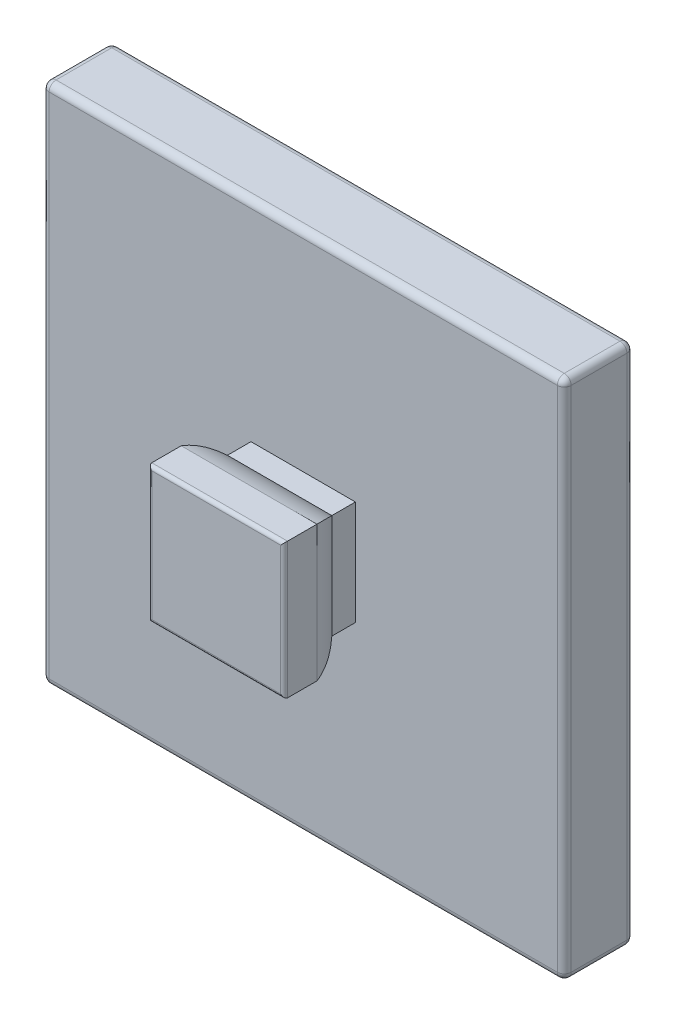
ISO-10303-21;
HEADER;
FILE_DESCRIPTION(('STEP AP214'),'2;1');
FILE_NAME('part.step','',(''),(''),'','','');
FILE_SCHEMA(('AUTOMOTIVE_DESIGN { 1 0 10303 214 1 1 1 1 }'));
ENDSEC;
DATA;
#1=APPLICATION_CONTEXT('core data for automotive mechanical design processes');
#2=APPLICATION_PROTOCOL_DEFINITION('international standard','automotive_design',2000,#1);
#3=PRODUCT_CONTEXT('',#1,'mechanical');
#4=PRODUCT('Part','Part','',(#3));
#5=PRODUCT_RELATED_PRODUCT_CATEGORY('part','',(#4));
#6=PRODUCT_DEFINITION_FORMATION('','',#4);
#7=PRODUCT_DEFINITION_CONTEXT('part definition',#1,'design');
#8=PRODUCT_DEFINITION('design','',#6,#7);
#9=PRODUCT_DEFINITION_SHAPE('','',#8);
#10=(LENGTH_UNIT() NAMED_UNIT(*) SI_UNIT(.MILLI.,.METRE.));
#11=(NAMED_UNIT(*) PLANE_ANGLE_UNIT() SI_UNIT($,.RADIAN.));
#12=(NAMED_UNIT(*) SI_UNIT($,.STERADIAN.) SOLID_ANGLE_UNIT());
#13=UNCERTAINTY_MEASURE_WITH_UNIT(LENGTH_MEASURE(1.E-05),#10,'distance_accuracy_value','');
#14=(GEOMETRIC_REPRESENTATION_CONTEXT(3) GLOBAL_UNCERTAINTY_ASSIGNED_CONTEXT((#13)) GLOBAL_UNIT_ASSIGNED_CONTEXT((#10,
#11,#12)) REPRESENTATION_CONTEXT('',''));
#15=CARTESIAN_POINT('',(0.,0.,0.));
#16=DIRECTION('',(0.,0.,1.));
#17=DIRECTION('',(1.,0.,0.));
#18=AXIS2_PLACEMENT_3D('',#15,#16,#17);
#19=CARTESIAN_POINT('',(0.,-2.,2.));
#20=DIRECTION('',(0.,1.,0.));
#21=DIRECTION('',(0.,0.,1.));
#22=AXIS2_PLACEMENT_3D('',#19,#20,#21);
#23=CYLINDRICAL_SURFACE('',#22,2.);
#24=DIRECTION('',(0.,1.,0.));
#25=VECTOR('',#24,1.);
#26=CARTESIAN_POINT('',(-1.95,-2.,1.55559027913422));
#27=LINE('',#26,#25);
#28=CARTESIAN_POINT('',(-1.95,-1.95,1.55559027913422));
#29=VERTEX_POINT('',#28);
#30=CARTESIAN_POINT('',(-1.95,1.95,1.55559027913422));
#31=VERTEX_POINT('',#30);
#32=EDGE_CURVE('E204',#29,#31,#27,.T.);
#33=ORIENTED_EDGE('',*,*,#32,.T.);
#34=CARTESIAN_POINT('',(0.,0.,2.));
#35=DIRECTION('',(0.707106781186547,0.707106781186548,0.));
#36=DIRECTION('',(0.707106781186547,-0.707106781186548,0.));
#37=AXIS2_PLACEMENT_3D('',#34,#35,#36);
#38=ELLIPSE('',#37,2.82842712474619,2.);
#39=CARTESIAN_POINT('',(-1.5,1.5,0.677124344467706));
#40=VERTEX_POINT('',#39);
#41=EDGE_CURVE('E186',#31,#40,#38,.F.);
#42=ORIENTED_EDGE('',*,*,#41,.T.);
#43=DIRECTION('',(0.,1.,0.));
#44=VECTOR('',#43,1.);
#45=CARTESIAN_POINT('',(-1.5,-2.,0.677124344467706));
#46=LINE('',#45,#44);
#47=CARTESIAN_POINT('',(-1.5,-1.5,0.677124344467706));
#48=VERTEX_POINT('',#47);
#49=EDGE_CURVE('E201',#48,#40,#46,.T.);
#50=ORIENTED_EDGE('',*,*,#49,.F.);
#51=CARTESIAN_POINT('',(0.,0.,2.));
#52=DIRECTION('',(0.707106781186547,-0.707106781186548,0.));
#53=DIRECTION('',(0.707106781186547,0.707106781186548,0.));
#54=AXIS2_PLACEMENT_3D('',#51,#52,#53);
#55=ELLIPSE('',#54,2.82842712474619,2.);
#56=EDGE_CURVE('E498',#48,#29,#55,.F.);
#57=ORIENTED_EDGE('',*,*,#56,.T.);
#58=EDGE_LOOP('',(#33,#42,#50,#57));
#59=FACE_BOUND('',#58,.T.);
#60=ADVANCED_FACE('F34',(#59),#23,.T.);
#61=CARTESIAN_POINT('',(0.,-2.,2.));
#62=DIRECTION('',(0.,1.,0.));
#63=DIRECTION('',(0.,0.,1.));
#64=AXIS2_PLACEMENT_3D('',#61,#62,#63);
#65=CYLINDRICAL_SURFACE('',#64,2.);
#66=DIRECTION('',(0.,1.,0.));
#67=VECTOR('',#66,1.);
#68=CARTESIAN_POINT('',(1.5,-2.,0.677124344467706));
#69=LINE('',#68,#67);
#70=CARTESIAN_POINT('',(1.5,-1.5,0.677124344467706));
#71=VERTEX_POINT('',#70);
#72=CARTESIAN_POINT('',(1.5,1.5,0.677124344467705));
#73=VERTEX_POINT('',#72);
#74=EDGE_CURVE('E215',#71,#73,#69,.T.);
#75=ORIENTED_EDGE('',*,*,#74,.T.);
#76=CARTESIAN_POINT('',(0.,0.,2.));
#77=DIRECTION('',(-0.707106781186547,0.707106781186548,0.));
#78=DIRECTION('',(-0.707106781186547,-0.707106781186548,0.));
#79=AXIS2_PLACEMENT_3D('',#76,#77,#78);
#80=ELLIPSE('',#79,2.82842712474619,2.);
#81=CARTESIAN_POINT('',(1.95,1.95,1.55559027913422));
#82=VERTEX_POINT('',#81);
#83=EDGE_CURVE('E189',#82,#73,#80,.T.);
#84=ORIENTED_EDGE('',*,*,#83,.F.);
#85=DIRECTION('',(0.,1.,0.));
#86=VECTOR('',#85,1.);
#87=CARTESIAN_POINT('',(1.95,-2.,1.55559027913422));
#88=LINE('',#87,#86);
#89=CARTESIAN_POINT('',(1.95,-1.95,1.55559027913422));
#90=VERTEX_POINT('',#89);
#91=EDGE_CURVE('E512',#90,#82,#88,.T.);
#92=ORIENTED_EDGE('',*,*,#91,.F.);
#93=CARTESIAN_POINT('',(0.,0.,2.));
#94=DIRECTION('',(-0.707106781186547,-0.707106781186548,0.));
#95=DIRECTION('',(-0.707106781186547,0.707106781186548,0.));
#96=AXIS2_PLACEMENT_3D('',#93,#94,#95);
#97=ELLIPSE('',#96,2.82842712474619,2.);
#98=EDGE_CURVE('E497',#71,#90,#97,.T.);
#99=ORIENTED_EDGE('',*,*,#98,.F.);
#100=EDGE_LOOP('',(#75,#84,#92,#99));
#101=FACE_BOUND('',#100,.T.);
#102=ADVANCED_FACE('F451',(#101),#65,.T.);
#103=CARTESIAN_POINT('',(1.95,-2.,2.5));
#104=DIRECTION('',(1.,0.,0.));
#105=DIRECTION('',(0.,0.,-1.));
#106=AXIS2_PLACEMENT_3D('',#103,#104,#105);
#107=PLANE('',#106);
#108=DIRECTION('',(0.,0.,-1.));
#109=VECTOR('',#108,1.);
#110=CARTESIAN_POINT('',(1.95,1.95,2.5));
#111=LINE('',#110,#109);
#112=CARTESIAN_POINT('',(1.95,1.95,2.4));
#113=VERTEX_POINT('',#112);
#114=EDGE_CURVE('E503',#113,#82,#111,.T.);
#115=ORIENTED_EDGE('',*,*,#114,.F.);
#116=DIRECTION('',(0.,1.,0.));
#117=VECTOR('',#116,1.);
#118=CARTESIAN_POINT('',(1.95,-2.,2.4));
#119=LINE('',#118,#117);
#120=CARTESIAN_POINT('',(1.95,-1.95,2.4));
#121=VERTEX_POINT('',#120);
#122=EDGE_CURVE('E246',#113,#121,#119,.F.);
#123=ORIENTED_EDGE('',*,*,#122,.T.);
#124=DIRECTION('',(0.,0.,1.));
#125=VECTOR('',#124,1.);
#126=CARTESIAN_POINT('',(1.95,-1.95,2.5));
#127=LINE('',#126,#125);
#128=EDGE_CURVE('E501',#90,#121,#127,.T.);
#129=ORIENTED_EDGE('',*,*,#128,.F.);
#130=ORIENTED_EDGE('',*,*,#91,.T.);
#131=EDGE_LOOP('',(#115,#123,#129,#130));
#132=FACE_BOUND('',#131,.T.);
#133=ADVANCED_FACE('F456',(#132),#107,.T.);
#134=CARTESIAN_POINT('',(-1.95,-2.,2.5));
#135=DIRECTION('',(0.,0.,1.));
#136=DIRECTION('',(1.,0.,0.));
#137=AXIS2_PLACEMENT_3D('',#134,#135,#136);
#138=PLANE('',#137);
#139=DIRECTION('',(0.,1.,0.));
#140=VECTOR('',#139,1.);
#141=CARTESIAN_POINT('',(-1.85,-2.,2.5));
#142=LINE('',#141,#140);
#143=CARTESIAN_POINT('',(-1.85,1.85,2.5));
#144=VERTEX_POINT('',#143);
#145=CARTESIAN_POINT('',(-1.85,-1.85,2.5));
#146=VERTEX_POINT('',#145);
#147=EDGE_CURVE('E237',#144,#146,#142,.F.);
#148=ORIENTED_EDGE('',*,*,#147,.T.);
#149=DIRECTION('',(-1.,0.,0.));
#150=VECTOR('',#149,1.);
#151=CARTESIAN_POINT('',(-1.95,-1.85,2.5));
#152=LINE('',#151,#150);
#153=CARTESIAN_POINT('',(1.85,-1.85,2.5));
#154=VERTEX_POINT('',#153);
#155=EDGE_CURVE('E239',#146,#154,#152,.F.);
#156=ORIENTED_EDGE('',*,*,#155,.T.);
#157=DIRECTION('',(0.,1.,0.));
#158=VECTOR('',#157,1.);
#159=CARTESIAN_POINT('',(1.85,-2.,2.5));
#160=LINE('',#159,#158);
#161=CARTESIAN_POINT('',(1.85,1.85,2.5));
#162=VERTEX_POINT('',#161);
#163=EDGE_CURVE('E233',#154,#162,#160,.T.);
#164=ORIENTED_EDGE('',*,*,#163,.T.);
#165=DIRECTION('',(-1.,0.,0.));
#166=VECTOR('',#165,1.);
#167=CARTESIAN_POINT('',(-1.95,1.85,2.5));
#168=LINE('',#167,#166);
#169=EDGE_CURVE('E235',#162,#144,#168,.T.);
#170=ORIENTED_EDGE('',*,*,#169,.T.);
#171=EDGE_LOOP('',(#148,#156,#164,#170));
#172=FACE_BOUND('',#171,.T.);
#173=ADVANCED_FACE('F485',(#172),#138,.T.);
#174=CARTESIAN_POINT('',(-1.95,-2.,2.5));
#175=DIRECTION('',(-1.,0.,0.));
#176=DIRECTION('',(0.,0.,1.));
#177=AXIS2_PLACEMENT_3D('',#174,#175,#176);
#178=PLANE('',#177);
#179=DIRECTION('',(0.,0.,1.));
#180=VECTOR('',#179,1.);
#181=CARTESIAN_POINT('',(-1.95,-1.95,2.5));
#182=LINE('',#181,#180);
#183=CARTESIAN_POINT('',(-1.95,-1.95,2.4));
#184=VERTEX_POINT('',#183);
#185=EDGE_CURVE('E493',#29,#184,#182,.T.);
#186=ORIENTED_EDGE('',*,*,#185,.T.);
#187=DIRECTION('',(0.,1.,0.));
#188=VECTOR('',#187,1.);
#189=CARTESIAN_POINT('',(-1.95,-2.,2.4));
#190=LINE('',#189,#188);
#191=CARTESIAN_POINT('',(-1.95,1.95,2.4));
#192=VERTEX_POINT('',#191);
#193=EDGE_CURVE('E242',#184,#192,#190,.T.);
#194=ORIENTED_EDGE('',*,*,#193,.T.);
#195=DIRECTION('',(0.,0.,-1.));
#196=VECTOR('',#195,1.);
#197=CARTESIAN_POINT('',(-1.95,1.95,2.5));
#198=LINE('',#197,#196);
#199=EDGE_CURVE('E205',#192,#31,#198,.T.);
#200=ORIENTED_EDGE('',*,*,#199,.T.);
#201=ORIENTED_EDGE('',*,*,#32,.F.);
#202=EDGE_LOOP('',(#186,#194,#200,#201));
#203=FACE_BOUND('',#202,.T.);
#204=ADVANCED_FACE('F461',(#203),#178,.T.);
#205=CARTESIAN_POINT('',(-7.5,7.5,0.));
#206=DIRECTION('',(0.,0.,-1.));
#207=DIRECTION('',(-1.,0.,0.));
#208=AXIS2_PLACEMENT_3D('',#205,#206,#207);
#209=PLANE('',#208);
#210=DIRECTION('',(0.,-1.,0.));
#211=VECTOR('',#210,1.);
#212=CARTESIAN_POINT('',(-7.3,-7.5,0.));
#213=LINE('',#212,#211);
#214=CARTESIAN_POINT('',(-7.3,7.3,0.));
#215=VERTEX_POINT('',#214);
#216=CARTESIAN_POINT('',(-7.3,-7.3,0.));
#217=VERTEX_POINT('',#216);
#218=EDGE_CURVE('E279',#215,#217,#213,.T.);
#219=ORIENTED_EDGE('',*,*,#218,.T.);
#220=DIRECTION('',(1.,0.,0.));
#221=VECTOR('',#220,1.);
#222=CARTESIAN_POINT('',(7.5,-7.3,0.));
#223=LINE('',#222,#221);
#224=CARTESIAN_POINT('',(7.3,-7.3,0.));
#225=VERTEX_POINT('',#224);
#226=EDGE_CURVE('E281',#217,#225,#223,.T.);
#227=ORIENTED_EDGE('',*,*,#226,.T.);
#228=DIRECTION('',(0.,1.,0.));
#229=VECTOR('',#228,1.);
#230=CARTESIAN_POINT('',(7.3,7.5,0.));
#231=LINE('',#230,#229);
#232=CARTESIAN_POINT('',(7.3,7.3,0.));
#233=VERTEX_POINT('',#232);
#234=EDGE_CURVE('E275',#225,#233,#231,.T.);
#235=ORIENTED_EDGE('',*,*,#234,.T.);
#236=DIRECTION('',(-1.,0.,0.));
#237=VECTOR('',#236,1.);
#238=CARTESIAN_POINT('',(-7.5,7.3,0.));
#239=LINE('',#238,#237);
#240=EDGE_CURVE('E277',#233,#215,#239,.T.);
#241=ORIENTED_EDGE('',*,*,#240,.T.);
#242=EDGE_LOOP('',(#219,#227,#235,#241));
#243=FACE_BOUND('',#242,.T.);
#244=DIRECTION('',(0.,-1.,0.));
#245=VECTOR('',#244,1.);
#246=CARTESIAN_POINT('',(-1.5,-1.5,0.));
#247=LINE('',#246,#245);
#248=CARTESIAN_POINT('',(-1.5,1.5,0.));
#249=VERTEX_POINT('',#248);
#250=CARTESIAN_POINT('',(-1.5,-1.5,0.));
#251=VERTEX_POINT('',#250);
#252=EDGE_CURVE('E517',#249,#251,#247,.T.);
#253=ORIENTED_EDGE('',*,*,#252,.F.);
#254=DIRECTION('',(-1.,0.,0.));
#255=VECTOR('',#254,1.);
#256=CARTESIAN_POINT('',(-1.5,1.5,0.));
#257=LINE('',#256,#255);
#258=CARTESIAN_POINT('',(1.5,1.5,0.));
#259=VERTEX_POINT('',#258);
#260=EDGE_CURVE('E220',#259,#249,#257,.T.);
#261=ORIENTED_EDGE('',*,*,#260,.F.);
#262=DIRECTION('',(0.,1.,0.));
#263=VECTOR('',#262,1.);
#264=CARTESIAN_POINT('',(1.5,-1.5,0.));
#265=LINE('',#264,#263);
#266=CARTESIAN_POINT('',(1.5,-1.5,0.));
#267=VERTEX_POINT('',#266);
#268=EDGE_CURVE('E225',#267,#259,#265,.T.);
#269=ORIENTED_EDGE('',*,*,#268,.F.);
#270=DIRECTION('',(1.,0.,0.));
#271=VECTOR('',#270,1.);
#272=CARTESIAN_POINT('',(-1.5,-1.5,0.));
#273=LINE('',#272,#271);
#274=EDGE_CURVE('E519',#251,#267,#273,.T.);
#275=ORIENTED_EDGE('',*,*,#274,.F.);
#276=EDGE_LOOP('',(#253,#261,#269,#275));
#277=FACE_BOUND('',#276,.T.);
#278=ADVANCED_FACE('F422',(#243,#277),#209,.F.);
#279=CARTESIAN_POINT('',(-7.5,-7.5,-2.));
#280=DIRECTION('',(-1.,0.,0.));
#281=DIRECTION('',(0.,0.,1.));
#282=AXIS2_PLACEMENT_3D('',#279,#280,#281);
#283=PLANE('',#282);
#284=DIRECTION('',(0.,-1.,0.));
#285=VECTOR('',#284,1.);
#286=CARTESIAN_POINT('',(-7.5,-7.5,-1.8));
#287=LINE('',#286,#285);
#288=CARTESIAN_POINT('',(-7.5,7.3,-1.8));
#289=VERTEX_POINT('',#288);
#290=CARTESIAN_POINT('',(-7.5,-7.3,-1.8));
#291=VERTEX_POINT('',#290);
#292=EDGE_CURVE('E288',#289,#291,#287,.T.);
#293=ORIENTED_EDGE('',*,*,#292,.T.);
#294=DIRECTION('',(0.,0.,1.));
#295=VECTOR('',#294,1.);
#296=CARTESIAN_POINT('',(-7.5,-7.3,-2.));
#297=LINE('',#296,#295);
#298=CARTESIAN_POINT('',(-7.5,-7.3,-0.2));
#299=VERTEX_POINT('',#298);
#300=EDGE_CURVE('E290',#291,#299,#297,.T.);
#301=ORIENTED_EDGE('',*,*,#300,.T.);
#302=DIRECTION('',(0.,-1.,0.));
#303=VECTOR('',#302,1.);
#304=CARTESIAN_POINT('',(-7.5,7.5,-0.2));
#305=LINE('',#304,#303);
#306=CARTESIAN_POINT('',(-7.5,7.3,-0.2));
#307=VERTEX_POINT('',#306);
#308=EDGE_CURVE('E286',#299,#307,#305,.F.);
#309=ORIENTED_EDGE('',*,*,#308,.T.);
#310=DIRECTION('',(0.,0.,1.));
#311=VECTOR('',#310,1.);
#312=CARTESIAN_POINT('',(-7.5,7.3,-2.));
#313=LINE('',#312,#311);
#314=EDGE_CURVE('E284',#307,#289,#313,.F.);
#315=ORIENTED_EDGE('',*,*,#314,.T.);
#316=EDGE_LOOP('',(#293,#301,#309,#315));
#317=FACE_BOUND('',#316,.T.);
#318=ADVANCED_FACE('F406',(#317),#283,.T.);
#319=CARTESIAN_POINT('',(-7.5,7.5,-2.));
#320=DIRECTION('',(0.,1.,0.));
#321=DIRECTION('',(0.,0.,1.));
#322=AXIS2_PLACEMENT_3D('',#319,#320,#321);
#323=PLANE('',#322);
#324=DIRECTION('',(-1.,0.,0.));
#325=VECTOR('',#324,1.);
#326=CARTESIAN_POINT('',(-7.5,7.5,-1.8));
#327=LINE('',#326,#325);
#328=CARTESIAN_POINT('',(7.3,7.5,-1.8));
#329=VERTEX_POINT('',#328);
#330=CARTESIAN_POINT('',(-7.3,7.5,-1.8));
#331=VERTEX_POINT('',#330);
#332=EDGE_CURVE('E297',#329,#331,#327,.T.);
#333=ORIENTED_EDGE('',*,*,#332,.T.);
#334=DIRECTION('',(0.,0.,1.));
#335=VECTOR('',#334,1.);
#336=CARTESIAN_POINT('',(-7.3,7.5,-2.));
#337=LINE('',#336,#335);
#338=CARTESIAN_POINT('',(-7.3,7.5,-0.2));
#339=VERTEX_POINT('',#338);
#340=EDGE_CURVE('E299',#331,#339,#337,.T.);
#341=ORIENTED_EDGE('',*,*,#340,.T.);
#342=DIRECTION('',(-1.,0.,0.));
#343=VECTOR('',#342,1.);
#344=CARTESIAN_POINT('',(7.5,7.5,-0.2));
#345=LINE('',#344,#343);
#346=CARTESIAN_POINT('',(7.3,7.5,-0.2));
#347=VERTEX_POINT('',#346);
#348=EDGE_CURVE('E295',#339,#347,#345,.F.);
#349=ORIENTED_EDGE('',*,*,#348,.T.);
#350=DIRECTION('',(0.,0.,1.));
#351=VECTOR('',#350,1.);
#352=CARTESIAN_POINT('',(7.3,7.5,-2.));
#353=LINE('',#352,#351);
#354=EDGE_CURVE('E293',#347,#329,#353,.F.);
#355=ORIENTED_EDGE('',*,*,#354,.T.);
#356=EDGE_LOOP('',(#333,#341,#349,#355));
#357=FACE_BOUND('',#356,.T.);
#358=ADVANCED_FACE('F385',(#357),#323,.T.);
#359=CARTESIAN_POINT('',(7.5,-7.5,-2.));
#360=DIRECTION('',(1.,0.,0.));
#361=DIRECTION('',(0.,0.,-1.));
#362=AXIS2_PLACEMENT_3D('',#359,#360,#361);
#363=PLANE('',#362);
#364=DIRECTION('',(0.,1.,0.));
#365=VECTOR('',#364,1.);
#366=CARTESIAN_POINT('',(7.5,-7.5,-1.8));
#367=LINE('',#366,#365);
#368=CARTESIAN_POINT('',(7.5,-7.3,-1.8));
#369=VERTEX_POINT('',#368);
#370=CARTESIAN_POINT('',(7.5,7.3,-1.8));
#371=VERTEX_POINT('',#370);
#372=EDGE_CURVE('E43',#369,#371,#367,.T.);
#373=ORIENTED_EDGE('',*,*,#372,.T.);
#374=DIRECTION('',(0.,0.,1.));
#375=VECTOR('',#374,1.);
#376=CARTESIAN_POINT('',(7.5,7.3,-2.));
#377=LINE('',#376,#375);
#378=CARTESIAN_POINT('',(7.5,7.3,-0.2));
#379=VERTEX_POINT('',#378);
#380=EDGE_CURVE('E11',#371,#379,#377,.T.);
#381=ORIENTED_EDGE('',*,*,#380,.T.);
#382=DIRECTION('',(0.,1.,0.));
#383=VECTOR('',#382,1.);
#384=CARTESIAN_POINT('',(7.5,-7.5,-0.2));
#385=LINE('',#384,#383);
#386=CARTESIAN_POINT('',(7.5,-7.3,-0.2));
#387=VERTEX_POINT('',#386);
#388=EDGE_CURVE('E302',#379,#387,#385,.F.);
#389=ORIENTED_EDGE('',*,*,#388,.T.);
#390=DIRECTION('',(0.,0.,1.));
#391=VECTOR('',#390,1.);
#392=CARTESIAN_POINT('',(7.5,-7.3,-2.));
#393=LINE('',#392,#391);
#394=EDGE_CURVE('E54',#387,#369,#393,.F.);
#395=ORIENTED_EDGE('',*,*,#394,.T.);
#396=EDGE_LOOP('',(#373,#381,#389,#395));
#397=FACE_BOUND('',#396,.T.);
#398=ADVANCED_FACE('F438',(#397),#363,.T.);
#399=CARTESIAN_POINT('',(-7.5,-7.5,-2.));
#400=DIRECTION('',(0.,-1.,0.));
#401=DIRECTION('',(0.,0.,-1.));
#402=AXIS2_PLACEMENT_3D('',#399,#400,#401);
#403=PLANE('',#402);
#404=DIRECTION('',(1.,0.,0.));
#405=VECTOR('',#404,1.);
#406=CARTESIAN_POINT('',(-7.5,-7.5,-0.2));
#407=LINE('',#406,#405);
#408=CARTESIAN_POINT('',(7.3,-7.5,-0.2));
#409=VERTEX_POINT('',#408);
#410=CARTESIAN_POINT('',(-7.3,-7.5,-0.2));
#411=VERTEX_POINT('',#410);
#412=EDGE_CURVE('E259',#409,#411,#407,.F.);
#413=ORIENTED_EDGE('',*,*,#412,.T.);
#414=DIRECTION('',(0.,0.,1.));
#415=VECTOR('',#414,1.);
#416=CARTESIAN_POINT('',(-7.3,-7.5,-2.));
#417=LINE('',#416,#415);
#418=CARTESIAN_POINT('',(-7.3,-7.5,-1.8));
#419=VERTEX_POINT('',#418);
#420=EDGE_CURVE('E264',#411,#419,#417,.F.);
#421=ORIENTED_EDGE('',*,*,#420,.T.);
#422=DIRECTION('',(1.,0.,0.));
#423=VECTOR('',#422,1.);
#424=CARTESIAN_POINT('',(-7.5,-7.5,-1.8));
#425=LINE('',#424,#423);
#426=CARTESIAN_POINT('',(7.3,-7.5,-1.8));
#427=VERTEX_POINT('',#426);
#428=EDGE_CURVE('E261',#419,#427,#425,.T.);
#429=ORIENTED_EDGE('',*,*,#428,.T.);
#430=DIRECTION('',(0.,0.,1.));
#431=VECTOR('',#430,1.);
#432=CARTESIAN_POINT('',(7.3,-7.5,-2.));
#433=LINE('',#432,#431);
#434=EDGE_CURVE('E248',#427,#409,#433,.T.);
#435=ORIENTED_EDGE('',*,*,#434,.T.);
#436=EDGE_LOOP('',(#413,#421,#429,#435));
#437=FACE_BOUND('',#436,.T.);
#438=ADVANCED_FACE('F440',(#437),#403,.T.);
#439=CARTESIAN_POINT('',(-7.5,7.5,-2.));
#440=DIRECTION('',(0.,0.,-1.));
#441=DIRECTION('',(-1.,0.,0.));
#442=AXIS2_PLACEMENT_3D('',#439,#440,#441);
#443=PLANE('',#442);
#444=DIRECTION('',(0.,1.,0.));
#445=VECTOR('',#444,1.);
#446=CARTESIAN_POINT('',(7.3,7.5,-2.));
#447=LINE('',#446,#445);
#448=CARTESIAN_POINT('',(7.3,7.3,-2.));
#449=VERTEX_POINT('',#448);
#450=CARTESIAN_POINT('',(7.3,-7.3,-2.));
#451=VERTEX_POINT('',#450);
#452=EDGE_CURVE('E266',#449,#451,#447,.F.);
#453=ORIENTED_EDGE('',*,*,#452,.T.);
#454=DIRECTION('',(1.,0.,0.));
#455=VECTOR('',#454,1.);
#456=CARTESIAN_POINT('',(-7.5,-7.3,-2.));
#457=LINE('',#456,#455);
#458=CARTESIAN_POINT('',(-7.3,-7.3,-2.));
#459=VERTEX_POINT('',#458);
#460=EDGE_CURVE('E272',#451,#459,#457,.F.);
#461=ORIENTED_EDGE('',*,*,#460,.T.);
#462=DIRECTION('',(0.,-1.,0.));
#463=VECTOR('',#462,1.);
#464=CARTESIAN_POINT('',(-7.3,7.5,-2.));
#465=LINE('',#464,#463);
#466=CARTESIAN_POINT('',(-7.3,7.3,-2.));
#467=VERTEX_POINT('',#466);
#468=EDGE_CURVE('E270',#459,#467,#465,.F.);
#469=ORIENTED_EDGE('',*,*,#468,.T.);
#470=DIRECTION('',(-1.,0.,0.));
#471=VECTOR('',#470,1.);
#472=CARTESIAN_POINT('',(-7.5,7.3,-2.));
#473=LINE('',#472,#471);
#474=EDGE_CURVE('E268',#467,#449,#473,.F.);
#475=ORIENTED_EDGE('',*,*,#474,.T.);
#476=EDGE_LOOP('',(#453,#461,#469,#475));
#477=FACE_BOUND('',#476,.T.);
#478=ADVANCED_FACE('F446',(#477),#443,.T.);
#479=CARTESIAN_POINT('',(-1.5,-1.5,1.));
#480=DIRECTION('',(1.,0.,0.));
#481=DIRECTION('',(0.,0.,-1.));
#482=AXIS2_PLACEMENT_3D('',#479,#480,#481);
#483=PLANE('',#482);
#484=DIRECTION('',(0.,0.,-1.));
#485=VECTOR('',#484,1.);
#486=CARTESIAN_POINT('',(-1.5,-1.5,1.));
#487=LINE('',#486,#485);
#488=EDGE_CURVE('E195',#48,#251,#487,.T.);
#489=ORIENTED_EDGE('',*,*,#488,.F.);
#490=ORIENTED_EDGE('',*,*,#49,.T.);
#491=DIRECTION('',(0.,0.,-1.));
#492=VECTOR('',#491,1.);
#493=CARTESIAN_POINT('',(-1.5,1.5,1.));
#494=LINE('',#493,#492);
#495=EDGE_CURVE('E212',#40,#249,#494,.T.);
#496=ORIENTED_EDGE('',*,*,#495,.T.);
#497=ORIENTED_EDGE('',*,*,#252,.T.);
#498=EDGE_LOOP('',(#489,#490,#496,#497));
#499=FACE_BOUND('',#498,.T.);
#500=ADVANCED_FACE('F210',(#499),#483,.F.);
#501=CARTESIAN_POINT('',(-1.5,-1.5,1.));
#502=DIRECTION('',(0.,1.,0.));
#503=DIRECTION('',(0.,0.,1.));
#504=AXIS2_PLACEMENT_3D('',#501,#502,#503);
#505=PLANE('',#504);
#506=DIRECTION('',(0.,0.,-1.));
#507=VECTOR('',#506,1.);
#508=CARTESIAN_POINT('',(1.5,-1.5,1.));
#509=LINE('',#508,#507);
#510=EDGE_CURVE('E223',#71,#267,#509,.T.);
#511=ORIENTED_EDGE('',*,*,#510,.F.);
#512=DIRECTION('',(-1.,0.,0.));
#513=VECTOR('',#512,1.);
#514=CARTESIAN_POINT('',(-1.5,-1.5,0.677124344467706));
#515=LINE('',#514,#513);
#516=EDGE_CURVE('E214',#71,#48,#515,.T.);
#517=ORIENTED_EDGE('',*,*,#516,.T.);
#518=ORIENTED_EDGE('',*,*,#488,.T.);
#519=ORIENTED_EDGE('',*,*,#274,.T.);
#520=EDGE_LOOP('',(#511,#517,#518,#519));
#521=FACE_BOUND('',#520,.T.);
#522=ADVANCED_FACE('F469',(#521),#505,.F.);
#523=CARTESIAN_POINT('',(1.5,-1.5,1.));
#524=DIRECTION('',(-1.,0.,0.));
#525=DIRECTION('',(0.,0.,1.));
#526=AXIS2_PLACEMENT_3D('',#523,#524,#525);
#527=PLANE('',#526);
#528=DIRECTION('',(0.,0.,-1.));
#529=VECTOR('',#528,1.);
#530=CARTESIAN_POINT('',(1.5,1.5,1.));
#531=LINE('',#530,#529);
#532=EDGE_CURVE('E221',#73,#259,#531,.T.);
#533=ORIENTED_EDGE('',*,*,#532,.F.);
#534=ORIENTED_EDGE('',*,*,#74,.F.);
#535=ORIENTED_EDGE('',*,*,#510,.T.);
#536=ORIENTED_EDGE('',*,*,#268,.T.);
#537=EDGE_LOOP('',(#533,#534,#535,#536));
#538=FACE_BOUND('',#537,.T.);
#539=ADVANCED_FACE('F466',(#538),#527,.F.);
#540=CARTESIAN_POINT('',(-1.5,1.5,1.));
#541=DIRECTION('',(0.,-1.,0.));
#542=DIRECTION('',(0.,0.,-1.));
#543=AXIS2_PLACEMENT_3D('',#540,#541,#542);
#544=PLANE('',#543);
#545=ORIENTED_EDGE('',*,*,#495,.F.);
#546=DIRECTION('',(1.,0.,0.));
#547=VECTOR('',#546,1.);
#548=CARTESIAN_POINT('',(-1.5,1.5,0.677124344467706));
#549=LINE('',#548,#547);
#550=EDGE_CURVE('E182',#40,#73,#549,.T.);
#551=ORIENTED_EDGE('',*,*,#550,.T.);
#552=ORIENTED_EDGE('',*,*,#532,.T.);
#553=ORIENTED_EDGE('',*,*,#260,.T.);
#554=EDGE_LOOP('',(#545,#551,#552,#553));
#555=FACE_BOUND('',#554,.T.);
#556=ADVANCED_FACE('F218',(#555),#544,.F.);
#557=CARTESIAN_POINT('',(7.501,0.,2.));
#558=DIRECTION('',(-1.,0.,0.));
#559=DIRECTION('',(0.,0.,1.));
#560=AXIS2_PLACEMENT_3D('',#557,#558,#559);
#561=CYLINDRICAL_SURFACE('',#560,2.);
#562=ORIENTED_EDGE('',*,*,#98,.T.);
#563=DIRECTION('',(-1.,0.,0.));
#564=VECTOR('',#563,1.);
#565=CARTESIAN_POINT('',(7.501,-1.95,1.55559027913422));
#566=LINE('',#565,#564);
#567=EDGE_CURVE('E509',#90,#29,#566,.T.);
#568=ORIENTED_EDGE('',*,*,#567,.T.);
#569=ORIENTED_EDGE('',*,*,#56,.F.);
#570=ORIENTED_EDGE('',*,*,#516,.F.);
#571=EDGE_LOOP('',(#562,#568,#569,#570));
#572=FACE_BOUND('',#571,.T.);
#573=ADVANCED_FACE('F465',(#572),#561,.T.);
#574=CARTESIAN_POINT('',(7.501,-1.95,2.5));
#575=DIRECTION('',(0.,-1.,0.));
#576=DIRECTION('',(0.,0.,-1.));
#577=AXIS2_PLACEMENT_3D('',#574,#575,#576);
#578=PLANE('',#577);
#579=ORIENTED_EDGE('',*,*,#128,.T.);
#580=DIRECTION('',(-1.,0.,0.));
#581=VECTOR('',#580,1.);
#582=CARTESIAN_POINT('',(7.501,-1.95,2.4));
#583=LINE('',#582,#581);
#584=EDGE_CURVE('E194',#121,#184,#583,.T.);
#585=ORIENTED_EDGE('',*,*,#584,.T.);
#586=ORIENTED_EDGE('',*,*,#185,.F.);
#587=ORIENTED_EDGE('',*,*,#567,.F.);
#588=EDGE_LOOP('',(#579,#585,#586,#587));
#589=FACE_BOUND('',#588,.T.);
#590=ADVANCED_FACE('F535',(#589),#578,.T.);
#591=CARTESIAN_POINT('',(7.501,0.,2.));
#592=DIRECTION('',(-1.,0.,0.));
#593=DIRECTION('',(0.,0.,1.));
#594=AXIS2_PLACEMENT_3D('',#591,#592,#593);
#595=CYLINDRICAL_SURFACE('',#594,2.);
#596=ORIENTED_EDGE('',*,*,#83,.T.);
#597=ORIENTED_EDGE('',*,*,#550,.F.);
#598=ORIENTED_EDGE('',*,*,#41,.F.);
#599=DIRECTION('',(-1.,0.,0.));
#600=VECTOR('',#599,1.);
#601=CARTESIAN_POINT('',(7.501,1.95,1.55559027913422));
#602=LINE('',#601,#600);
#603=EDGE_CURVE('E555',#82,#31,#602,.T.);
#604=ORIENTED_EDGE('',*,*,#603,.F.);
#605=EDGE_LOOP('',(#596,#597,#598,#604));
#606=FACE_BOUND('',#605,.T.);
#607=ADVANCED_FACE('F184',(#606),#595,.T.);
#608=CARTESIAN_POINT('',(7.501,1.95,2.5));
#609=DIRECTION('',(0.,1.,0.));
#610=DIRECTION('',(0.,0.,1.));
#611=AXIS2_PLACEMENT_3D('',#608,#609,#610);
#612=PLANE('',#611);
#613=ORIENTED_EDGE('',*,*,#199,.F.);
#614=DIRECTION('',(-1.,0.,0.));
#615=VECTOR('',#614,1.);
#616=CARTESIAN_POINT('',(7.501,1.95,2.4));
#617=LINE('',#616,#615);
#618=EDGE_CURVE('E244',#192,#113,#617,.F.);
#619=ORIENTED_EDGE('',*,*,#618,.T.);
#620=ORIENTED_EDGE('',*,*,#114,.T.);
#621=ORIENTED_EDGE('',*,*,#603,.T.);
#622=EDGE_LOOP('',(#613,#619,#620,#621));
#623=FACE_BOUND('',#622,.T.);
#624=ADVANCED_FACE('F553',(#623),#612,.T.);
#625=CARTESIAN_POINT('',(-1.95,1.85,2.4));
#626=DIRECTION('',(-1.,0.,0.));
#627=DIRECTION('',(0.,0.,1.));
#628=AXIS2_PLACEMENT_3D('',#625,#626,#627);
#629=CYLINDRICAL_SURFACE('',#628,0.1);
#630=CARTESIAN_POINT('',(-1.85,1.85,2.4));
#631=DIRECTION('',(-0.707106781186547,-0.707106781186547,0.));
#632=DIRECTION('',(-0.707106781186547,0.707106781186547,0.));
#633=AXIS2_PLACEMENT_3D('',#630,#631,#632);
#634=ELLIPSE('',#633,0.14142135623731,0.1);
#635=EDGE_CURVE('E253',#144,#192,#634,.T.);
#636=ORIENTED_EDGE('',*,*,#635,.F.);
#637=ORIENTED_EDGE('',*,*,#169,.F.);
#638=CARTESIAN_POINT('',(1.85,1.85,2.4));
#639=DIRECTION('',(-0.707106781186547,0.707106781186547,0.));
#640=DIRECTION('',(0.707106781186547,0.707106781186547,0.));
#641=AXIS2_PLACEMENT_3D('',#638,#639,#640);
#642=ELLIPSE('',#641,0.14142135623731,0.1);
#643=EDGE_CURVE('E206',#113,#162,#642,.F.);
#644=ORIENTED_EDGE('',*,*,#643,.F.);
#645=ORIENTED_EDGE('',*,*,#618,.F.);
#646=EDGE_LOOP('',(#636,#637,#644,#645));
#647=FACE_BOUND('',#646,.T.);
#648=ADVANCED_FACE('F551',(#647),#629,.T.);
#649=CARTESIAN_POINT('',(1.85,-2.,2.4));
#650=DIRECTION('',(0.,1.,0.));
#651=DIRECTION('',(0.,0.,1.));
#652=AXIS2_PLACEMENT_3D('',#649,#650,#651);
#653=CYLINDRICAL_SURFACE('',#652,0.1);
#654=ORIENTED_EDGE('',*,*,#643,.T.);
#655=ORIENTED_EDGE('',*,*,#163,.F.);
#656=CARTESIAN_POINT('',(1.85,-1.85,2.4));
#657=DIRECTION('',(0.707106781186547,0.707106781186547,0.));
#658=DIRECTION('',(-0.707106781186547,0.707106781186547,0.));
#659=AXIS2_PLACEMENT_3D('',#656,#657,#658);
#660=ELLIPSE('',#659,0.14142135623731,0.1);
#661=EDGE_CURVE('E251',#121,#154,#660,.F.);
#662=ORIENTED_EDGE('',*,*,#661,.F.);
#663=ORIENTED_EDGE('',*,*,#122,.F.);
#664=EDGE_LOOP('',(#654,#655,#662,#663));
#665=FACE_BOUND('',#664,.T.);
#666=ADVANCED_FACE('F539',(#665),#653,.T.);
#667=CARTESIAN_POINT('',(-1.85,-2.,2.4));
#668=DIRECTION('',(0.,1.,0.));
#669=DIRECTION('',(0.,0.,1.));
#670=AXIS2_PLACEMENT_3D('',#667,#668,#669);
#671=CYLINDRICAL_SURFACE('',#670,0.1);
#672=ORIENTED_EDGE('',*,*,#635,.T.);
#673=ORIENTED_EDGE('',*,*,#193,.F.);
#674=CARTESIAN_POINT('',(-1.85,-1.85,2.4));
#675=DIRECTION('',(-0.707106781186547,0.707106781186547,0.));
#676=DIRECTION('',(0.707106781186547,0.707106781186547,0.));
#677=AXIS2_PLACEMENT_3D('',#674,#675,#676);
#678=ELLIPSE('',#677,0.14142135623731,0.1);
#679=EDGE_CURVE('E249',#146,#184,#678,.F.);
#680=ORIENTED_EDGE('',*,*,#679,.F.);
#681=ORIENTED_EDGE('',*,*,#147,.F.);
#682=EDGE_LOOP('',(#672,#673,#680,#681));
#683=FACE_BOUND('',#682,.T.);
#684=ADVANCED_FACE('F546',(#683),#671,.T.);
#685=CARTESIAN_POINT('',(7.501,-1.85,2.4));
#686=DIRECTION('',(-1.,0.,0.));
#687=DIRECTION('',(0.,0.,1.));
#688=AXIS2_PLACEMENT_3D('',#685,#686,#687);
#689=CYLINDRICAL_SURFACE('',#688,0.1);
#690=ORIENTED_EDGE('',*,*,#661,.T.);
#691=ORIENTED_EDGE('',*,*,#155,.F.);
#692=ORIENTED_EDGE('',*,*,#679,.T.);
#693=ORIENTED_EDGE('',*,*,#584,.F.);
#694=EDGE_LOOP('',(#690,#691,#692,#693));
#695=FACE_BOUND('',#694,.T.);
#696=ADVANCED_FACE('F542',(#695),#689,.T.);
#697=CARTESIAN_POINT('',(-7.5,7.3,-0.2));
#698=DIRECTION('',(1.,0.,0.));
#699=DIRECTION('',(0.,0.,-1.));
#700=AXIS2_PLACEMENT_3D('',#697,#698,#699);
#701=CYLINDRICAL_SURFACE('',#700,0.2);
#702=CARTESIAN_POINT('',(-7.3,7.3,-0.2));
#703=DIRECTION('',(-1.,0.,0.));
#704=DIRECTION('',(0.,0.,1.));
#705=AXIS2_PLACEMENT_3D('',#702,#703,#704);
#706=CIRCLE('',#705,0.2);
#707=EDGE_CURVE('E38',#215,#339,#706,.T.);
#708=ORIENTED_EDGE('',*,*,#707,.F.);
#709=ORIENTED_EDGE('',*,*,#240,.F.);
#710=CARTESIAN_POINT('',(7.3,7.3,-0.2));
#711=DIRECTION('',(1.,0.,0.));
#712=DIRECTION('',(0.,0.,-1.));
#713=AXIS2_PLACEMENT_3D('',#710,#711,#712);
#714=CIRCLE('',#713,0.2);
#715=EDGE_CURVE('E366',#347,#233,#714,.T.);
#716=ORIENTED_EDGE('',*,*,#715,.F.);
#717=ORIENTED_EDGE('',*,*,#348,.F.);
#718=EDGE_LOOP('',(#708,#709,#716,#717));
#719=FACE_BOUND('',#718,.T.);
#720=ADVANCED_FACE('F36',(#719),#701,.T.);
#721=CARTESIAN_POINT('',(-7.3,7.3,-0.2));
#722=DIRECTION('',(0.,0.,1.));
#723=DIRECTION('',(1.,0.,0.));
#724=AXIS2_PLACEMENT_3D('',#721,#722,#723);
#725=SPHERICAL_SURFACE('',#724,0.2);
#726=CARTESIAN_POINT('',(-7.3,7.3,-0.2));
#727=DIRECTION('',(0.,1.,0.));
#728=DIRECTION('',(0.,0.,1.));
#729=AXIS2_PLACEMENT_3D('',#726,#727,#728);
#730=CIRCLE('',#729,0.2);
#731=EDGE_CURVE('E362',#215,#307,#730,.F.);
#732=ORIENTED_EDGE('',*,*,#731,.F.);
#733=ORIENTED_EDGE('',*,*,#707,.T.);
#734=CARTESIAN_POINT('',(-7.3,7.3,-0.2));
#735=DIRECTION('',(0.,0.,1.));
#736=DIRECTION('',(1.,0.,0.));
#737=AXIS2_PLACEMENT_3D('',#734,#735,#736);
#738=CIRCLE('',#737,0.2);
#739=EDGE_CURVE('E365',#307,#339,#738,.F.);
#740=ORIENTED_EDGE('',*,*,#739,.F.);
#741=EDGE_LOOP('',(#732,#733,#740));
#742=FACE_BOUND('',#741,.T.);
#743=ADVANCED_FACE('F378',(#742),#725,.T.);
#744=CARTESIAN_POINT('',(7.3,7.3,-0.2));
#745=DIRECTION('',(0.,0.,1.));
#746=DIRECTION('',(1.,0.,0.));
#747=AXIS2_PLACEMENT_3D('',#744,#745,#746);
#748=SPHERICAL_SURFACE('',#747,0.2);
#749=CARTESIAN_POINT('',(7.3,7.3,-0.2));
#750=DIRECTION('',(0.,0.,1.));
#751=DIRECTION('',(1.,0.,0.));
#752=AXIS2_PLACEMENT_3D('',#749,#750,#751);
#753=CIRCLE('',#752,0.2);
#754=EDGE_CURVE('E356',#347,#379,#753,.F.);
#755=ORIENTED_EDGE('',*,*,#754,.F.);
#756=ORIENTED_EDGE('',*,*,#715,.T.);
#757=CARTESIAN_POINT('',(7.3,7.3,-0.2));
#758=DIRECTION('',(0.,1.,0.));
#759=DIRECTION('',(-1.,0.,0.));
#760=AXIS2_PLACEMENT_3D('',#757,#758,#759);
#761=CIRCLE('',#760,0.2);
#762=EDGE_CURVE('E359',#379,#233,#761,.F.);
#763=ORIENTED_EDGE('',*,*,#762,.F.);
#764=EDGE_LOOP('',(#755,#756,#763));
#765=FACE_BOUND('',#764,.T.);
#766=ADVANCED_FACE('F434',(#765),#748,.T.);
#767=CARTESIAN_POINT('',(-7.3,7.3,-2.));
#768=DIRECTION('',(0.,0.,1.));
#769=DIRECTION('',(1.,0.,0.));
#770=AXIS2_PLACEMENT_3D('',#767,#768,#769);
#771=CYLINDRICAL_SURFACE('',#770,0.2);
#772=ORIENTED_EDGE('',*,*,#739,.T.);
#773=ORIENTED_EDGE('',*,*,#340,.F.);
#774=CARTESIAN_POINT('',(-7.3,7.3,-1.8));
#775=DIRECTION('',(0.,0.,-1.));
#776=DIRECTION('',(-1.,0.,0.));
#777=AXIS2_PLACEMENT_3D('',#774,#775,#776);
#778=CIRCLE('',#777,0.2);
#779=EDGE_CURVE('E350',#289,#331,#778,.T.);
#780=ORIENTED_EDGE('',*,*,#779,.F.);
#781=ORIENTED_EDGE('',*,*,#314,.F.);
#782=EDGE_LOOP('',(#772,#773,#780,#781));
#783=FACE_BOUND('',#782,.T.);
#784=ADVANCED_FACE('F390',(#783),#771,.T.);
#785=CARTESIAN_POINT('',(-7.3,7.5,-0.2));
#786=DIRECTION('',(0.,1.,0.));
#787=DIRECTION('',(0.,0.,1.));
#788=AXIS2_PLACEMENT_3D('',#785,#786,#787);
#789=CYLINDRICAL_SURFACE('',#788,0.2);
#790=ORIENTED_EDGE('',*,*,#731,.T.);
#791=ORIENTED_EDGE('',*,*,#308,.F.);
#792=CARTESIAN_POINT('',(-7.3,-7.3,-0.2));
#793=DIRECTION('',(0.,-1.,0.));
#794=DIRECTION('',(1.,0.,0.));
#795=AXIS2_PLACEMENT_3D('',#792,#793,#794);
#796=CIRCLE('',#795,0.2);
#797=EDGE_CURVE('E347',#217,#299,#796,.T.);
#798=ORIENTED_EDGE('',*,*,#797,.F.);
#799=ORIENTED_EDGE('',*,*,#218,.F.);
#800=EDGE_LOOP('',(#790,#791,#798,#799));
#801=FACE_BOUND('',#800,.T.);
#802=ADVANCED_FACE('F419',(#801),#789,.T.);
#803=CARTESIAN_POINT('',(-7.5,-7.3,-0.2));
#804=DIRECTION('',(-1.,0.,0.));
#805=DIRECTION('',(0.,0.,1.));
#806=AXIS2_PLACEMENT_3D('',#803,#804,#805);
#807=CYLINDRICAL_SURFACE('',#806,0.2);
#808=CARTESIAN_POINT('',(7.3,-7.3,-0.2));
#809=DIRECTION('',(1.,0.,0.));
#810=DIRECTION('',(0.,0.,-1.));
#811=AXIS2_PLACEMENT_3D('',#808,#809,#810);
#812=CIRCLE('',#811,0.2);
#813=EDGE_CURVE('E341',#225,#409,#812,.T.);
#814=ORIENTED_EDGE('',*,*,#813,.F.);
#815=ORIENTED_EDGE('',*,*,#226,.F.);
#816=CARTESIAN_POINT('',(-7.3,-7.3,-0.2));
#817=DIRECTION('',(-1.,0.,0.));
#818=DIRECTION('',(0.,0.,1.));
#819=AXIS2_PLACEMENT_3D('',#816,#817,#818);
#820=CIRCLE('',#819,0.2);
#821=EDGE_CURVE('E344',#411,#217,#820,.T.);
#822=ORIENTED_EDGE('',*,*,#821,.F.);
#823=ORIENTED_EDGE('',*,*,#412,.F.);
#824=EDGE_LOOP('',(#814,#815,#822,#823));
#825=FACE_BOUND('',#824,.T.);
#826=ADVANCED_FACE('F426',(#825),#807,.T.);
#827=CARTESIAN_POINT('',(7.3,7.5,-0.2));
#828=DIRECTION('',(0.,-1.,0.));
#829=DIRECTION('',(0.,0.,-1.));
#830=AXIS2_PLACEMENT_3D('',#827,#828,#829);
#831=CYLINDRICAL_SURFACE('',#830,0.2);
#832=ORIENTED_EDGE('',*,*,#762,.T.);
#833=ORIENTED_EDGE('',*,*,#234,.F.);
#834=CARTESIAN_POINT('',(7.3,-7.3,-0.2));
#835=DIRECTION('',(0.,-1.,0.));
#836=DIRECTION('',(0.,0.,-1.));
#837=AXIS2_PLACEMENT_3D('',#834,#835,#836);
#838=CIRCLE('',#837,0.2);
#839=EDGE_CURVE('E339',#387,#225,#838,.T.);
#840=ORIENTED_EDGE('',*,*,#839,.F.);
#841=ORIENTED_EDGE('',*,*,#388,.F.);
#842=EDGE_LOOP('',(#832,#833,#840,#841));
#843=FACE_BOUND('',#842,.T.);
#844=ADVANCED_FACE('F433',(#843),#831,.T.);
#845=CARTESIAN_POINT('',(7.3,7.3,-2.));
#846=DIRECTION('',(0.,0.,1.));
#847=DIRECTION('',(1.,0.,0.));
#848=AXIS2_PLACEMENT_3D('',#845,#846,#847);
#849=CYLINDRICAL_SURFACE('',#848,0.2);
#850=ORIENTED_EDGE('',*,*,#754,.T.);
#851=ORIENTED_EDGE('',*,*,#380,.F.);
#852=CARTESIAN_POINT('',(7.3,7.3,-1.8));
#853=DIRECTION('',(0.,0.,-1.));
#854=DIRECTION('',(-1.,0.,0.));
#855=AXIS2_PLACEMENT_3D('',#852,#853,#854);
#856=CIRCLE('',#855,0.2);
#857=EDGE_CURVE('E336',#329,#371,#856,.T.);
#858=ORIENTED_EDGE('',*,*,#857,.F.);
#859=ORIENTED_EDGE('',*,*,#354,.F.);
#860=EDGE_LOOP('',(#850,#851,#858,#859));
#861=FACE_BOUND('',#860,.T.);
#862=ADVANCED_FACE('F437',(#861),#849,.T.);
#863=CARTESIAN_POINT('',(-7.5,7.3,-1.8));
#864=DIRECTION('',(-1.,0.,0.));
#865=DIRECTION('',(0.,0.,1.));
#866=AXIS2_PLACEMENT_3D('',#863,#864,#865);
#867=CYLINDRICAL_SURFACE('',#866,0.2);
#868=CARTESIAN_POINT('',(-7.3,7.3,-1.8));
#869=DIRECTION('',(-1.,0.,0.));
#870=DIRECTION('',(0.,0.,1.));
#871=AXIS2_PLACEMENT_3D('',#868,#869,#870);
#872=CIRCLE('',#871,0.2);
#873=EDGE_CURVE('E353',#331,#467,#872,.T.);
#874=ORIENTED_EDGE('',*,*,#873,.F.);
#875=ORIENTED_EDGE('',*,*,#332,.F.);
#876=CARTESIAN_POINT('',(7.3,7.3,-1.8));
#877=DIRECTION('',(1.,0.,0.));
#878=DIRECTION('',(0.,0.,-1.));
#879=AXIS2_PLACEMENT_3D('',#876,#877,#878);
#880=CIRCLE('',#879,0.2);
#881=EDGE_CURVE('E333',#449,#329,#880,.T.);
#882=ORIENTED_EDGE('',*,*,#881,.F.);
#883=ORIENTED_EDGE('',*,*,#474,.F.);
#884=EDGE_LOOP('',(#874,#875,#882,#883));
#885=FACE_BOUND('',#884,.T.);
#886=ADVANCED_FACE('F394',(#885),#867,.T.);
#887=CARTESIAN_POINT('',(-7.3,7.3,-1.8));
#888=DIRECTION('',(0.,0.,1.));
#889=DIRECTION('',(1.,0.,0.));
#890=AXIS2_PLACEMENT_3D('',#887,#888,#889);
#891=SPHERICAL_SURFACE('',#890,0.2);
#892=ORIENTED_EDGE('',*,*,#779,.T.);
#893=ORIENTED_EDGE('',*,*,#873,.T.);
#894=CARTESIAN_POINT('',(-7.3,7.3,-1.8));
#895=DIRECTION('',(0.,1.,0.));
#896=DIRECTION('',(0.,0.,1.));
#897=AXIS2_PLACEMENT_3D('',#894,#895,#896);
#898=CIRCLE('',#897,0.2);
#899=EDGE_CURVE('E330',#289,#467,#898,.F.);
#900=ORIENTED_EDGE('',*,*,#899,.F.);
#901=EDGE_LOOP('',(#892,#893,#900));
#902=FACE_BOUND('',#901,.T.);
#903=ADVANCED_FACE('F398',(#902),#891,.T.);
#904=CARTESIAN_POINT('',(-7.3,-7.3,-0.2));
#905=DIRECTION('',(0.,0.,1.));
#906=DIRECTION('',(1.,0.,0.));
#907=AXIS2_PLACEMENT_3D('',#904,#905,#906);
#908=SPHERICAL_SURFACE('',#907,0.2);
#909=ORIENTED_EDGE('',*,*,#821,.T.);
#910=ORIENTED_EDGE('',*,*,#797,.T.);
#911=CARTESIAN_POINT('',(-7.3,-7.3,-0.2));
#912=DIRECTION('',(0.,0.,1.));
#913=DIRECTION('',(1.,0.,0.));
#914=AXIS2_PLACEMENT_3D('',#911,#912,#913);
#915=CIRCLE('',#914,0.2);
#916=EDGE_CURVE('E328',#411,#299,#915,.F.);
#917=ORIENTED_EDGE('',*,*,#916,.F.);
#918=EDGE_LOOP('',(#909,#910,#917));
#919=FACE_BOUND('',#918,.T.);
#920=ADVANCED_FACE('F416',(#919),#908,.T.);
#921=CARTESIAN_POINT('',(7.3,-7.3,-0.2));
#922=DIRECTION('',(0.,0.,1.));
#923=DIRECTION('',(1.,0.,0.));
#924=AXIS2_PLACEMENT_3D('',#921,#922,#923);
#925=SPHERICAL_SURFACE('',#924,0.2);
#926=ORIENTED_EDGE('',*,*,#839,.T.);
#927=ORIENTED_EDGE('',*,*,#813,.T.);
#928=CARTESIAN_POINT('',(7.3,-7.3,-0.2));
#929=DIRECTION('',(0.,0.,1.));
#930=DIRECTION('',(1.,0.,0.));
#931=AXIS2_PLACEMENT_3D('',#928,#929,#930);
#932=CIRCLE('',#931,0.2);
#933=EDGE_CURVE('E325',#387,#409,#932,.F.);
#934=ORIENTED_EDGE('',*,*,#933,.F.);
#935=EDGE_LOOP('',(#926,#927,#934));
#936=FACE_BOUND('',#935,.T.);
#937=ADVANCED_FACE('F749',(#936),#925,.T.);
#938=CARTESIAN_POINT('',(7.3,7.3,-1.8));
#939=DIRECTION('',(0.,0.,1.));
#940=DIRECTION('',(1.,0.,0.));
#941=AXIS2_PLACEMENT_3D('',#938,#939,#940);
#942=SPHERICAL_SURFACE('',#941,0.2);
#943=ORIENTED_EDGE('',*,*,#881,.T.);
#944=ORIENTED_EDGE('',*,*,#857,.T.);
#945=CARTESIAN_POINT('',(7.3,7.3,-1.8));
#946=DIRECTION('',(0.,1.,0.));
#947=DIRECTION('',(0.,0.,1.));
#948=AXIS2_PLACEMENT_3D('',#945,#946,#947);
#949=CIRCLE('',#948,0.2);
#950=EDGE_CURVE('E322',#449,#371,#949,.F.);
#951=ORIENTED_EDGE('',*,*,#950,.F.);
#952=EDGE_LOOP('',(#943,#944,#951));
#953=FACE_BOUND('',#952,.T.);
#954=ADVANCED_FACE('F758',(#953),#942,.T.);
#955=CARTESIAN_POINT('',(-7.3,-7.5,-1.8));
#956=DIRECTION('',(0.,-1.,0.));
#957=DIRECTION('',(0.,0.,-1.));
#958=AXIS2_PLACEMENT_3D('',#955,#956,#957);
#959=CYLINDRICAL_SURFACE('',#958,0.2);
#960=ORIENTED_EDGE('',*,*,#899,.T.);
#961=ORIENTED_EDGE('',*,*,#468,.F.);
#962=CARTESIAN_POINT('',(-7.3,-7.3,-1.8));
#963=DIRECTION('',(0.,-1.,0.));
#964=DIRECTION('',(0.,0.,-1.));
#965=AXIS2_PLACEMENT_3D('',#962,#963,#964);
#966=CIRCLE('',#965,0.2);
#967=EDGE_CURVE('E319',#291,#459,#966,.T.);
#968=ORIENTED_EDGE('',*,*,#967,.F.);
#969=ORIENTED_EDGE('',*,*,#292,.F.);
#970=EDGE_LOOP('',(#960,#961,#968,#969));
#971=FACE_BOUND('',#970,.T.);
#972=ADVANCED_FACE('F403',(#971),#959,.T.);
#973=CARTESIAN_POINT('',(-7.3,-7.3,-2.));
#974=DIRECTION('',(0.,0.,1.));
#975=DIRECTION('',(1.,0.,0.));
#976=AXIS2_PLACEMENT_3D('',#973,#974,#975);
#977=CYLINDRICAL_SURFACE('',#976,0.2);
#978=ORIENTED_EDGE('',*,*,#916,.T.);
#979=ORIENTED_EDGE('',*,*,#300,.F.);
#980=CARTESIAN_POINT('',(-7.3,-7.3,-1.8));
#981=DIRECTION('',(0.,0.,-1.));
#982=DIRECTION('',(-1.,0.,0.));
#983=AXIS2_PLACEMENT_3D('',#980,#981,#982);
#984=CIRCLE('',#983,0.2);
#985=EDGE_CURVE('E316',#419,#291,#984,.T.);
#986=ORIENTED_EDGE('',*,*,#985,.F.);
#987=ORIENTED_EDGE('',*,*,#420,.F.);
#988=EDGE_LOOP('',(#978,#979,#986,#987));
#989=FACE_BOUND('',#988,.T.);
#990=ADVANCED_FACE('F409',(#989),#977,.T.);
#991=CARTESIAN_POINT('',(7.3,-7.3,-2.));
#992=DIRECTION('',(0.,0.,1.));
#993=DIRECTION('',(1.,0.,0.));
#994=AXIS2_PLACEMENT_3D('',#991,#992,#993);
#995=CYLINDRICAL_SURFACE('',#994,0.2);
#996=ORIENTED_EDGE('',*,*,#933,.T.);
#997=ORIENTED_EDGE('',*,*,#434,.F.);
#998=CARTESIAN_POINT('',(7.3,-7.3,-1.8));
#999=DIRECTION('',(0.,0.,-1.));
#1000=DIRECTION('',(-1.,0.,0.));
#1001=AXIS2_PLACEMENT_3D('',#998,#999,#1000);
#1002=CIRCLE('',#1001,0.2);
#1003=EDGE_CURVE('E313',#369,#427,#1002,.T.);
#1004=ORIENTED_EDGE('',*,*,#1003,.F.);
#1005=ORIENTED_EDGE('',*,*,#394,.F.);
#1006=EDGE_LOOP('',(#996,#997,#1004,#1005));
#1007=FACE_BOUND('',#1006,.T.);
#1008=ADVANCED_FACE('F784',(#1007),#995,.T.);
#1009=CARTESIAN_POINT('',(7.3,-7.5,-1.8));
#1010=DIRECTION('',(0.,1.,0.));
#1011=DIRECTION('',(0.,0.,1.));
#1012=AXIS2_PLACEMENT_3D('',#1009,#1010,#1011);
#1013=CYLINDRICAL_SURFACE('',#1012,0.2);
#1014=ORIENTED_EDGE('',*,*,#950,.T.);
#1015=ORIENTED_EDGE('',*,*,#372,.F.);
#1016=CARTESIAN_POINT('',(7.3,-7.3,-1.8));
#1017=DIRECTION('',(0.,-1.,0.));
#1018=DIRECTION('',(0.,0.,-1.));
#1019=AXIS2_PLACEMENT_3D('',#1016,#1017,#1018);
#1020=CIRCLE('',#1019,0.2);
#1021=EDGE_CURVE('E310',#451,#369,#1020,.T.);
#1022=ORIENTED_EDGE('',*,*,#1021,.F.);
#1023=ORIENTED_EDGE('',*,*,#452,.F.);
#1024=EDGE_LOOP('',(#1014,#1015,#1022,#1023));
#1025=FACE_BOUND('',#1024,.T.);
#1026=ADVANCED_FACE('F793',(#1025),#1013,.T.);
#1027=CARTESIAN_POINT('',(-7.3,-7.3,-1.8));
#1028=DIRECTION('',(0.,0.,1.));
#1029=DIRECTION('',(1.,0.,0.));
#1030=AXIS2_PLACEMENT_3D('',#1027,#1028,#1029);
#1031=SPHERICAL_SURFACE('',#1030,0.2);
#1032=ORIENTED_EDGE('',*,*,#985,.T.);
#1033=ORIENTED_EDGE('',*,*,#967,.T.);
#1034=CARTESIAN_POINT('',(-7.3,-7.3,-1.8));
#1035=DIRECTION('',(-1.,0.,0.));
#1036=DIRECTION('',(0.,0.,1.));
#1037=AXIS2_PLACEMENT_3D('',#1034,#1035,#1036);
#1038=CIRCLE('',#1037,0.2);
#1039=EDGE_CURVE('E308',#419,#459,#1038,.F.);
#1040=ORIENTED_EDGE('',*,*,#1039,.F.);
#1041=EDGE_LOOP('',(#1032,#1033,#1040));
#1042=FACE_BOUND('',#1041,.T.);
#1043=ADVANCED_FACE('F803',(#1042),#1031,.T.);
#1044=CARTESIAN_POINT('',(7.3,-7.3,-1.8));
#1045=DIRECTION('',(0.,0.,1.));
#1046=DIRECTION('',(1.,0.,0.));
#1047=AXIS2_PLACEMENT_3D('',#1044,#1045,#1046);
#1048=SPHERICAL_SURFACE('',#1047,0.2);
#1049=ORIENTED_EDGE('',*,*,#1021,.T.);
#1050=ORIENTED_EDGE('',*,*,#1003,.T.);
#1051=CARTESIAN_POINT('',(7.3,-7.3,-1.8));
#1052=DIRECTION('',(1.,0.,0.));
#1053=DIRECTION('',(0.,0.,-1.));
#1054=AXIS2_PLACEMENT_3D('',#1051,#1052,#1053);
#1055=CIRCLE('',#1054,0.2);
#1056=EDGE_CURVE('E306',#451,#427,#1055,.F.);
#1057=ORIENTED_EDGE('',*,*,#1056,.F.);
#1058=EDGE_LOOP('',(#1049,#1050,#1057));
#1059=FACE_BOUND('',#1058,.T.);
#1060=ADVANCED_FACE('F813',(#1059),#1048,.T.);
#1061=CARTESIAN_POINT('',(-7.5,-7.3,-1.8));
#1062=DIRECTION('',(1.,0.,0.));
#1063=DIRECTION('',(0.,0.,-1.));
#1064=AXIS2_PLACEMENT_3D('',#1061,#1062,#1063);
#1065=CYLINDRICAL_SURFACE('',#1064,0.2);
#1066=ORIENTED_EDGE('',*,*,#1039,.T.);
#1067=ORIENTED_EDGE('',*,*,#460,.F.);
#1068=ORIENTED_EDGE('',*,*,#1056,.T.);
#1069=ORIENTED_EDGE('',*,*,#428,.F.);
#1070=EDGE_LOOP('',(#1066,#1067,#1068,#1069));
#1071=FACE_BOUND('',#1070,.T.);
#1072=ADVANCED_FACE('F823',(#1071),#1065,.T.);
#1073=CLOSED_SHELL('',(#60,#102,#133,#173,#204,#278,#318,#358,#398,#438,#478,#500,#522,#539,
#556,#573,#590,#607,#624,#648,#666,#684,#696,#720,#743,#766,#784,#802,#826,#844,#862,#886,#903,
#920,#937,#954,#972,#990,#1008,#1026,#1043,#1060,#1072));
#1074=MANIFOLD_SOLID_BREP('B2',#1073);
#1075=ADVANCED_BREP_SHAPE_REPRESENTATION('',(#18,#1074),#14);
#1076=SHAPE_DEFINITION_REPRESENTATION(#9,#1075);
ENDSEC;
END-ISO-10303-21;
